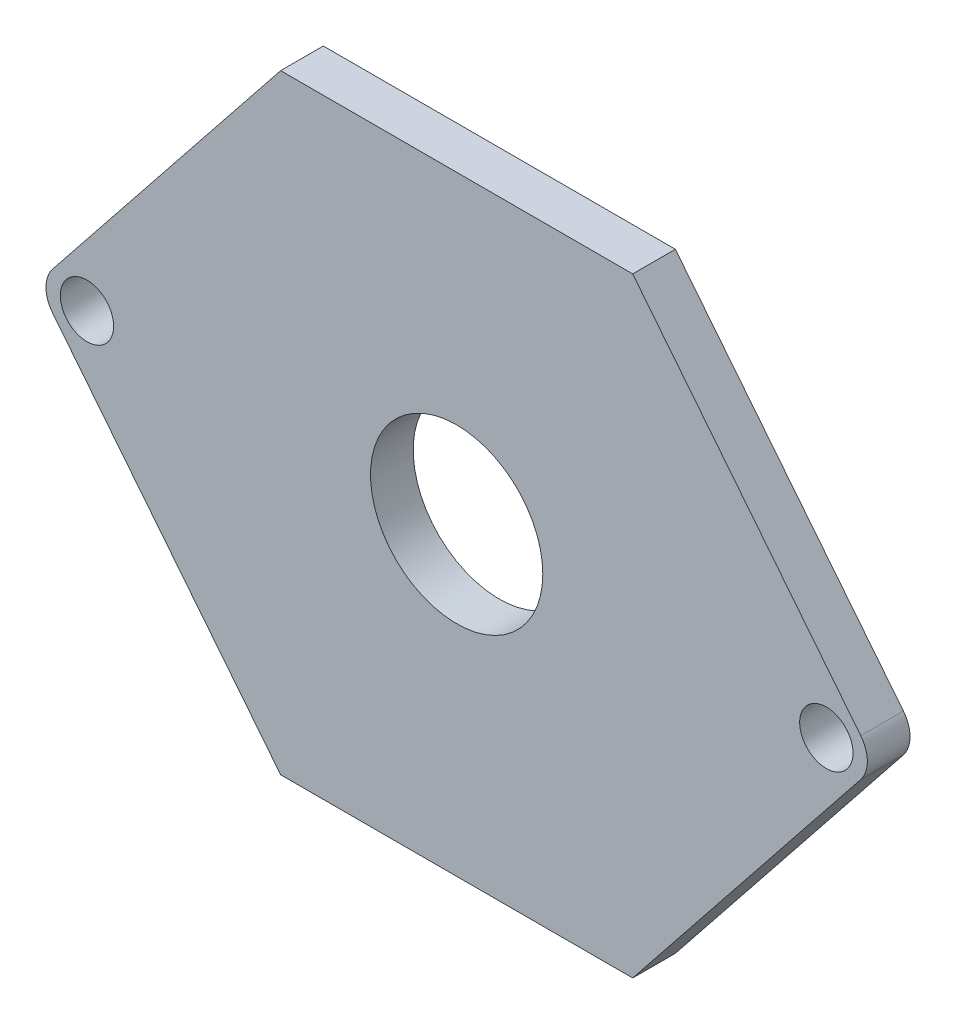
ISO-10303-21;
HEADER;
FILE_DESCRIPTION(('STEP AP214'),'2;1');
FILE_NAME('part.step','',(''),(''),'','','');
FILE_SCHEMA(('AUTOMOTIVE_DESIGN { 1 0 10303 214 1 1 1 1 }'));
ENDSEC;
DATA;
#1=APPLICATION_CONTEXT('core data for automotive mechanical design processes');
#2=APPLICATION_PROTOCOL_DEFINITION('international standard','automotive_design',2000,#1);
#3=PRODUCT_CONTEXT('',#1,'mechanical');
#4=PRODUCT('Part','Part','',(#3));
#5=PRODUCT_RELATED_PRODUCT_CATEGORY('part','',(#4));
#6=PRODUCT_DEFINITION_FORMATION('','',#4);
#7=PRODUCT_DEFINITION_CONTEXT('part definition',#1,'design');
#8=PRODUCT_DEFINITION('design','',#6,#7);
#9=PRODUCT_DEFINITION_SHAPE('','',#8);
#10=(LENGTH_UNIT() NAMED_UNIT(*) SI_UNIT(.MILLI.,.METRE.));
#11=(NAMED_UNIT(*) PLANE_ANGLE_UNIT() SI_UNIT($,.RADIAN.));
#12=(NAMED_UNIT(*) SI_UNIT($,.STERADIAN.) SOLID_ANGLE_UNIT());
#13=UNCERTAINTY_MEASURE_WITH_UNIT(LENGTH_MEASURE(1.E-05),#10,'distance_accuracy_value','');
#14=(GEOMETRIC_REPRESENTATION_CONTEXT(3) GLOBAL_UNCERTAINTY_ASSIGNED_CONTEXT((#13)) GLOBAL_UNIT_ASSIGNED_CONTEXT((#10,
#11,#12)) REPRESENTATION_CONTEXT('',''));
#15=CARTESIAN_POINT('',(0.,0.,0.));
#16=DIRECTION('',(0.,0.,1.));
#17=DIRECTION('',(1.,0.,0.));
#18=AXIS2_PLACEMENT_3D('',#15,#16,#17);
#19=CARTESIAN_POINT('',(0.,0.,2.8));
#20=DIRECTION('',(0.,0.,1.));
#21=DIRECTION('',(1.,0.,0.));
#22=AXIS2_PLACEMENT_3D('',#19,#20,#21);
#23=PLANE('',#22);
#24=CARTESIAN_POINT('',(24.25,0.,2.8));
#25=DIRECTION('',(0.,0.,1.));
#26=DIRECTION('',(1.,0.,0.));
#27=AXIS2_PLACEMENT_3D('',#24,#25,#26);
#28=CIRCLE('',#27,1.75);
#29=CARTESIAN_POINT('',(26.,0.,2.8));
#30=VERTEX_POINT('',#29);
#31=EDGE_CURVE('E188',#30,#30,#28,.T.);
#32=ORIENTED_EDGE('',*,*,#31,.F.);
#33=EDGE_LOOP('',(#32));
#34=FACE_BOUND('',#33,.T.);
#35=DIRECTION('',(0.623574065272578,0.781764277208566,0.));
#36=VECTOR('',#35,1.);
#37=CARTESIAN_POINT('',(27.5,0.,2.8));
#38=LINE('',#37,#36);
#39=CARTESIAN_POINT('',(11.5470053837927,-19.9999999999998,2.8));
#40=VERTEX_POINT('',#39);
#41=CARTESIAN_POINT('',(26.50521262939,-1.24714813054515,2.8));
#42=VERTEX_POINT('',#41);
#43=EDGE_CURVE('E168',#40,#42,#38,.T.);
#44=ORIENTED_EDGE('',*,*,#43,.T.);
#45=CARTESIAN_POINT('',(24.9416840749729,0.,2.8));
#46=DIRECTION('',(0.,0.,1.));
#47=DIRECTION('',(1.,0.,0.));
#48=AXIS2_PLACEMENT_3D('',#45,#46,#47);
#49=CIRCLE('',#48,2.);
#50=CARTESIAN_POINT('',(26.50521262939,1.24714813054517,2.8));
#51=VERTEX_POINT('',#50);
#52=EDGE_CURVE('E135',#42,#51,#49,.T.);
#53=ORIENTED_EDGE('',*,*,#52,.T.);
#54=DIRECTION('',(-0.623574065272579,0.781764277208565,0.));
#55=VECTOR('',#54,1.);
#56=CARTESIAN_POINT('',(11.5470053837925,20.,2.8));
#57=LINE('',#56,#55);
#58=CARTESIAN_POINT('',(11.5470053837925,20.,2.8));
#59=VERTEX_POINT('',#58);
#60=EDGE_CURVE('E109',#51,#59,#57,.T.);
#61=ORIENTED_EDGE('',*,*,#60,.T.);
#62=DIRECTION('',(-1.,0.,0.));
#63=VECTOR('',#62,1.);
#64=CARTESIAN_POINT('',(11.5470053837925,20.,2.8));
#65=LINE('',#64,#63);
#66=CARTESIAN_POINT('',(-11.5470053837926,19.9999999999999,2.8));
#67=VERTEX_POINT('',#66);
#68=EDGE_CURVE('E103',#59,#67,#65,.T.);
#69=ORIENTED_EDGE('',*,*,#68,.T.);
#70=DIRECTION('',(-0.623574065272579,-0.781764277208564,0.));
#71=VECTOR('',#70,1.);
#72=CARTESIAN_POINT('',(-11.5470053837926,19.9999999999999,2.8));
#73=LINE('',#72,#71);
#74=CARTESIAN_POINT('',(-26.50521262939,1.24714813054515,2.8));
#75=VERTEX_POINT('',#74);
#76=EDGE_CURVE('E96',#67,#75,#73,.T.);
#77=ORIENTED_EDGE('',*,*,#76,.T.);
#78=CARTESIAN_POINT('',(-24.9416840749729,0.,2.8));
#79=DIRECTION('',(0.,0.,1.));
#80=DIRECTION('',(1.,0.,0.));
#81=AXIS2_PLACEMENT_3D('',#78,#79,#80);
#82=CIRCLE('',#81,2.);
#83=CARTESIAN_POINT('',(-26.50521262939,-1.24714813054516,2.8));
#84=VERTEX_POINT('',#83);
#85=EDGE_CURVE('E49',#75,#84,#82,.T.);
#86=ORIENTED_EDGE('',*,*,#85,.T.);
#87=DIRECTION('',(0.623574065272579,-0.781764277208565,0.));
#88=VECTOR('',#87,1.);
#89=CARTESIAN_POINT('',(-27.5,0.,2.8));
#90=LINE('',#89,#88);
#91=CARTESIAN_POINT('',(-11.5470053837925,-20.,2.8));
#92=VERTEX_POINT('',#91);
#93=EDGE_CURVE('E102',#84,#92,#90,.T.);
#94=ORIENTED_EDGE('',*,*,#93,.T.);
#95=DIRECTION('',(1.,0.,0.));
#96=VECTOR('',#95,1.);
#97=CARTESIAN_POINT('',(-11.5470053837925,-20.,2.8));
#98=LINE('',#97,#96);
#99=EDGE_CURVE('E178',#92,#40,#98,.T.);
#100=ORIENTED_EDGE('',*,*,#99,.T.);
#101=EDGE_LOOP('',(#44,#53,#61,#69,#77,#86,#94,#100));
#102=FACE_BOUND('',#101,.T.);
#103=CARTESIAN_POINT('',(0.,0.,2.8));
#104=DIRECTION('',(0.,0.,1.));
#105=DIRECTION('',(1.,0.,0.));
#106=AXIS2_PLACEMENT_3D('',#103,#104,#105);
#107=CIRCLE('',#106,5.65066807194559);
#108=CARTESIAN_POINT('',(5.65066807194559,0.,2.8));
#109=VERTEX_POINT('',#108);
#110=EDGE_CURVE('E181',#109,#109,#107,.T.);
#111=ORIENTED_EDGE('',*,*,#110,.F.);
#112=EDGE_LOOP('',(#111));
#113=FACE_BOUND('',#112,.T.);
#114=CARTESIAN_POINT('',(-24.25,0.,2.8));
#115=DIRECTION('',(0.,0.,1.));
#116=DIRECTION('',(1.,0.,0.));
#117=AXIS2_PLACEMENT_3D('',#114,#115,#116);
#118=CIRCLE('',#117,1.75);
#119=CARTESIAN_POINT('',(-22.5,0.,2.8));
#120=VERTEX_POINT('',#119);
#121=EDGE_CURVE('E235',#120,#120,#118,.T.);
#122=ORIENTED_EDGE('',*,*,#121,.F.);
#123=EDGE_LOOP('',(#122));
#124=FACE_BOUND('',#123,.T.);
#125=ADVANCED_FACE('F34',(#34,#102,#113,#124),#23,.T.);
#126=CARTESIAN_POINT('',(0.,0.,0.));
#127=DIRECTION('',(0.,0.,1.));
#128=DIRECTION('',(1.,0.,0.));
#129=AXIS2_PLACEMENT_3D('',#126,#127,#128);
#130=PLANE('',#129);
#131=DIRECTION('',(-0.623574065272579,0.781764277208565,0.));
#132=VECTOR('',#131,1.);
#133=CARTESIAN_POINT('',(11.5470053837925,20.,0.));
#134=LINE('',#133,#132);
#135=CARTESIAN_POINT('',(26.50521262939,1.24714813054517,0.));
#136=VERTEX_POINT('',#135);
#137=CARTESIAN_POINT('',(11.5470053837925,20.,0.));
#138=VERTEX_POINT('',#137);
#139=EDGE_CURVE('E113',#136,#138,#134,.T.);
#140=ORIENTED_EDGE('',*,*,#139,.F.);
#141=CARTESIAN_POINT('',(24.9416840749729,0.,0.));
#142=DIRECTION('',(0.,0.,1.));
#143=DIRECTION('',(1.,0.,0.));
#144=AXIS2_PLACEMENT_3D('',#141,#142,#143);
#145=CIRCLE('',#144,2.);
#146=CARTESIAN_POINT('',(26.50521262939,-1.24714813054515,0.));
#147=VERTEX_POINT('',#146);
#148=EDGE_CURVE('E130',#136,#147,#145,.F.);
#149=ORIENTED_EDGE('',*,*,#148,.T.);
#150=DIRECTION('',(0.623574065272578,0.781764277208566,0.));
#151=VECTOR('',#150,1.);
#152=CARTESIAN_POINT('',(27.5,0.,0.));
#153=LINE('',#152,#151);
#154=CARTESIAN_POINT('',(11.5470053837927,-19.9999999999998,0.));
#155=VERTEX_POINT('',#154);
#156=EDGE_CURVE('E153',#155,#147,#153,.T.);
#157=ORIENTED_EDGE('',*,*,#156,.F.);
#158=DIRECTION('',(1.,0.,0.));
#159=VECTOR('',#158,1.);
#160=CARTESIAN_POINT('',(-11.5470053837925,-20.,0.));
#161=LINE('',#160,#159);
#162=CARTESIAN_POINT('',(-11.5470053837925,-20.,0.));
#163=VERTEX_POINT('',#162);
#164=EDGE_CURVE('E150',#163,#155,#161,.T.);
#165=ORIENTED_EDGE('',*,*,#164,.F.);
#166=DIRECTION('',(0.623574065272579,-0.781764277208565,0.));
#167=VECTOR('',#166,1.);
#168=CARTESIAN_POINT('',(-27.5,0.,0.));
#169=LINE('',#168,#167);
#170=CARTESIAN_POINT('',(-26.50521262939,-1.24714813054516,0.));
#171=VERTEX_POINT('',#170);
#172=EDGE_CURVE('E142',#171,#163,#169,.T.);
#173=ORIENTED_EDGE('',*,*,#172,.F.);
#174=CARTESIAN_POINT('',(-24.9416840749729,0.,0.));
#175=DIRECTION('',(0.,0.,1.));
#176=DIRECTION('',(1.,0.,0.));
#177=AXIS2_PLACEMENT_3D('',#174,#175,#176);
#178=CIRCLE('',#177,2.);
#179=CARTESIAN_POINT('',(-26.50521262939,1.24714813054515,0.));
#180=VERTEX_POINT('',#179);
#181=EDGE_CURVE('E122',#171,#180,#178,.F.);
#182=ORIENTED_EDGE('',*,*,#181,.T.);
#183=DIRECTION('',(-0.623574065272579,-0.781764277208564,0.));
#184=VECTOR('',#183,1.);
#185=CARTESIAN_POINT('',(-11.5470053837926,19.9999999999999,0.));
#186=LINE('',#185,#184);
#187=CARTESIAN_POINT('',(-11.5470053837926,19.9999999999999,0.));
#188=VERTEX_POINT('',#187);
#189=EDGE_CURVE('E151',#188,#180,#186,.T.);
#190=ORIENTED_EDGE('',*,*,#189,.F.);
#191=DIRECTION('',(-1.,0.,0.));
#192=VECTOR('',#191,1.);
#193=CARTESIAN_POINT('',(11.5470053837925,20.,0.));
#194=LINE('',#193,#192);
#195=EDGE_CURVE('E117',#138,#188,#194,.T.);
#196=ORIENTED_EDGE('',*,*,#195,.F.);
#197=EDGE_LOOP('',(#140,#149,#157,#165,#173,#182,#190,#196));
#198=FACE_BOUND('',#197,.T.);
#199=CARTESIAN_POINT('',(0.,0.,0.));
#200=DIRECTION('',(0.,0.,1.));
#201=DIRECTION('',(1.,0.,0.));
#202=AXIS2_PLACEMENT_3D('',#199,#200,#201);
#203=CIRCLE('',#202,5.65066807194559);
#204=CARTESIAN_POINT('',(5.65066807194559,0.,0.));
#205=VERTEX_POINT('',#204);
#206=EDGE_CURVE('E183',#205,#205,#203,.T.);
#207=ORIENTED_EDGE('',*,*,#206,.T.);
#208=EDGE_LOOP('',(#207));
#209=FACE_BOUND('',#208,.T.);
#210=CARTESIAN_POINT('',(24.25,0.,0.));
#211=DIRECTION('',(0.,0.,1.));
#212=DIRECTION('',(1.,0.,0.));
#213=AXIS2_PLACEMENT_3D('',#210,#211,#212);
#214=CIRCLE('',#213,1.75);
#215=CARTESIAN_POINT('',(26.,0.,0.));
#216=VERTEX_POINT('',#215);
#217=EDGE_CURVE('E191',#216,#216,#214,.T.);
#218=ORIENTED_EDGE('',*,*,#217,.T.);
#219=EDGE_LOOP('',(#218));
#220=FACE_BOUND('',#219,.T.);
#221=CARTESIAN_POINT('',(-24.25,0.,0.));
#222=DIRECTION('',(0.,0.,1.));
#223=DIRECTION('',(1.,0.,0.));
#224=AXIS2_PLACEMENT_3D('',#221,#222,#223);
#225=CIRCLE('',#224,1.75);
#226=CARTESIAN_POINT('',(-22.5,0.,0.));
#227=VERTEX_POINT('',#226);
#228=EDGE_CURVE('E233',#227,#227,#225,.T.);
#229=ORIENTED_EDGE('',*,*,#228,.T.);
#230=EDGE_LOOP('',(#229));
#231=FACE_BOUND('',#230,.T.);
#232=ADVANCED_FACE('F147',(#198,#209,#220,#231),#130,.F.);
#233=CARTESIAN_POINT('',(11.5470053837925,20.,2.8));
#234=DIRECTION('',(0.,-1.,0.));
#235=DIRECTION('',(1.,0.,0.));
#236=AXIS2_PLACEMENT_3D('',#233,#234,#235);
#237=PLANE('',#236);
#238=ORIENTED_EDGE('',*,*,#195,.T.);
#239=DIRECTION('',(0.,0.,-1.));
#240=VECTOR('',#239,1.);
#241=CARTESIAN_POINT('',(-11.5470053837926,19.9999999999999,2.8));
#242=LINE('',#241,#240);
#243=EDGE_CURVE('E100',#67,#188,#242,.T.);
#244=ORIENTED_EDGE('',*,*,#243,.F.);
#245=ORIENTED_EDGE('',*,*,#68,.F.);
#246=DIRECTION('',(0.,0.,-1.));
#247=VECTOR('',#246,1.);
#248=CARTESIAN_POINT('',(11.5470053837925,20.,2.8));
#249=LINE('',#248,#247);
#250=EDGE_CURVE('E161',#59,#138,#249,.T.);
#251=ORIENTED_EDGE('',*,*,#250,.T.);
#252=EDGE_LOOP('',(#238,#244,#245,#251));
#253=FACE_BOUND('',#252,.T.);
#254=ADVANCED_FACE('F115',(#253),#237,.F.);
#255=CARTESIAN_POINT('',(-11.5470053837926,19.9999999999999,2.8));
#256=DIRECTION('',(0.781764277208564,-0.623574065272579,0.));
#257=DIRECTION('',(0.623574065272579,0.781764277208564,0.));
#258=AXIS2_PLACEMENT_3D('',#255,#256,#257);
#259=PLANE('',#258);
#260=ORIENTED_EDGE('',*,*,#189,.T.);
#261=DIRECTION('',(0.,0.,-1.));
#262=VECTOR('',#261,1.);
#263=CARTESIAN_POINT('',(-26.50521262939,1.24714813054515,2.8));
#264=LINE('',#263,#262);
#265=EDGE_CURVE('E11',#180,#75,#264,.F.);
#266=ORIENTED_EDGE('',*,*,#265,.T.);
#267=ORIENTED_EDGE('',*,*,#76,.F.);
#268=ORIENTED_EDGE('',*,*,#243,.T.);
#269=EDGE_LOOP('',(#260,#266,#267,#268));
#270=FACE_BOUND('',#269,.T.);
#271=ADVANCED_FACE('F98',(#270),#259,.F.);
#272=CARTESIAN_POINT('',(-27.5,0.,2.8));
#273=DIRECTION('',(0.781764277208565,0.623574065272579,0.));
#274=DIRECTION('',(-0.623574065272579,0.781764277208565,0.));
#275=AXIS2_PLACEMENT_3D('',#272,#273,#274);
#276=PLANE('',#275);
#277=ORIENTED_EDGE('',*,*,#93,.F.);
#278=DIRECTION('',(0.,0.,-1.));
#279=VECTOR('',#278,1.);
#280=CARTESIAN_POINT('',(-26.50521262939,-1.24714813054516,2.8));
#281=LINE('',#280,#279);
#282=EDGE_CURVE('E42',#84,#171,#281,.T.);
#283=ORIENTED_EDGE('',*,*,#282,.T.);
#284=ORIENTED_EDGE('',*,*,#172,.T.);
#285=DIRECTION('',(0.,0.,-1.));
#286=VECTOR('',#285,1.);
#287=CARTESIAN_POINT('',(-11.5470053837925,-20.,2.8));
#288=LINE('',#287,#286);
#289=EDGE_CURVE('E119',#92,#163,#288,.T.);
#290=ORIENTED_EDGE('',*,*,#289,.F.);
#291=EDGE_LOOP('',(#277,#283,#284,#290));
#292=FACE_BOUND('',#291,.T.);
#293=ADVANCED_FACE('F140',(#292),#276,.F.);
#294=CARTESIAN_POINT('',(-11.5470053837925,-20.,2.8));
#295=DIRECTION('',(0.,1.,0.));
#296=DIRECTION('',(-1.,0.,0.));
#297=AXIS2_PLACEMENT_3D('',#294,#295,#296);
#298=PLANE('',#297);
#299=ORIENTED_EDGE('',*,*,#164,.T.);
#300=DIRECTION('',(0.,0.,-1.));
#301=VECTOR('',#300,1.);
#302=CARTESIAN_POINT('',(11.5470053837927,-19.9999999999998,2.8));
#303=LINE('',#302,#301);
#304=EDGE_CURVE('E125',#40,#155,#303,.T.);
#305=ORIENTED_EDGE('',*,*,#304,.F.);
#306=ORIENTED_EDGE('',*,*,#99,.F.);
#307=ORIENTED_EDGE('',*,*,#289,.T.);
#308=EDGE_LOOP('',(#299,#305,#306,#307));
#309=FACE_BOUND('',#308,.T.);
#310=ADVANCED_FACE('F194',(#309),#298,.F.);
#311=CARTESIAN_POINT('',(27.5,0.,2.8));
#312=DIRECTION('',(-0.781764277208566,0.623574065272578,0.));
#313=DIRECTION('',(-0.623574065272578,-0.781764277208566,0.));
#314=AXIS2_PLACEMENT_3D('',#311,#312,#313);
#315=PLANE('',#314);
#316=ORIENTED_EDGE('',*,*,#156,.T.);
#317=DIRECTION('',(0.,0.,-1.));
#318=VECTOR('',#317,1.);
#319=CARTESIAN_POINT('',(26.50521262939,-1.24714813054515,2.8));
#320=LINE('',#319,#318);
#321=EDGE_CURVE('E132',#147,#42,#320,.F.);
#322=ORIENTED_EDGE('',*,*,#321,.T.);
#323=ORIENTED_EDGE('',*,*,#43,.F.);
#324=ORIENTED_EDGE('',*,*,#304,.T.);
#325=EDGE_LOOP('',(#316,#322,#323,#324));
#326=FACE_BOUND('',#325,.T.);
#327=ADVANCED_FACE('F166',(#326),#315,.F.);
#328=CARTESIAN_POINT('',(11.5470053837925,20.,2.8));
#329=DIRECTION('',(-0.781764277208565,-0.623574065272579,0.));
#330=DIRECTION('',(0.623574065272579,-0.781764277208565,0.));
#331=AXIS2_PLACEMENT_3D('',#328,#329,#330);
#332=PLANE('',#331);
#333=ORIENTED_EDGE('',*,*,#60,.F.);
#334=DIRECTION('',(0.,0.,-1.));
#335=VECTOR('',#334,1.);
#336=CARTESIAN_POINT('',(26.50521262939,1.24714813054517,2.8));
#337=LINE('',#336,#335);
#338=EDGE_CURVE('E118',#51,#136,#337,.T.);
#339=ORIENTED_EDGE('',*,*,#338,.T.);
#340=ORIENTED_EDGE('',*,*,#139,.T.);
#341=ORIENTED_EDGE('',*,*,#250,.F.);
#342=EDGE_LOOP('',(#333,#339,#340,#341));
#343=FACE_BOUND('',#342,.T.);
#344=ADVANCED_FACE('F176',(#343),#332,.F.);
#345=CARTESIAN_POINT('',(0.,0.,2.8));
#346=DIRECTION('',(0.,0.,-1.));
#347=DIRECTION('',(-1.,0.,0.));
#348=AXIS2_PLACEMENT_3D('',#345,#346,#347);
#349=CYLINDRICAL_SURFACE('',#348,5.65066807194559);
#350=ORIENTED_EDGE('',*,*,#110,.T.);
#351=EDGE_LOOP('',(#350));
#352=FACE_BOUND('',#351,.T.);
#353=ORIENTED_EDGE('',*,*,#206,.F.);
#354=EDGE_LOOP('',(#353));
#355=FACE_BOUND('',#354,.T.);
#356=ADVANCED_FACE('F212',(#352,#355),#349,.F.);
#357=CARTESIAN_POINT('',(24.25,0.,2.8));
#358=DIRECTION('',(0.,0.,-1.));
#359=DIRECTION('',(-1.,0.,0.));
#360=AXIS2_PLACEMENT_3D('',#357,#358,#359);
#361=CYLINDRICAL_SURFACE('',#360,1.75);
#362=ORIENTED_EDGE('',*,*,#31,.T.);
#363=EDGE_LOOP('',(#362));
#364=FACE_BOUND('',#363,.T.);
#365=ORIENTED_EDGE('',*,*,#217,.F.);
#366=EDGE_LOOP('',(#365));
#367=FACE_BOUND('',#366,.T.);
#368=ADVANCED_FACE('F219',(#364,#367),#361,.F.);
#369=CARTESIAN_POINT('',(-24.25,0.,2.8));
#370=DIRECTION('',(0.,0.,-1.));
#371=DIRECTION('',(-1.,0.,0.));
#372=AXIS2_PLACEMENT_3D('',#369,#370,#371);
#373=CYLINDRICAL_SURFACE('',#372,1.75);
#374=ORIENTED_EDGE('',*,*,#121,.T.);
#375=EDGE_LOOP('',(#374));
#376=FACE_BOUND('',#375,.T.);
#377=ORIENTED_EDGE('',*,*,#228,.F.);
#378=EDGE_LOOP('',(#377));
#379=FACE_BOUND('',#378,.T.);
#380=ADVANCED_FACE('F223',(#376,#379),#373,.F.);
#381=CARTESIAN_POINT('',(24.9416840749729,0.,2.8));
#382=DIRECTION('',(0.,0.,-1.));
#383=DIRECTION('',(-1.,0.,0.));
#384=AXIS2_PLACEMENT_3D('',#381,#382,#383);
#385=CYLINDRICAL_SURFACE('',#384,2.);
#386=ORIENTED_EDGE('',*,*,#52,.F.);
#387=ORIENTED_EDGE('',*,*,#321,.F.);
#388=ORIENTED_EDGE('',*,*,#148,.F.);
#389=ORIENTED_EDGE('',*,*,#338,.F.);
#390=EDGE_LOOP('',(#386,#387,#388,#389));
#391=FACE_BOUND('',#390,.T.);
#392=ADVANCED_FACE('F174',(#391),#385,.T.);
#393=CARTESIAN_POINT('',(-24.9416840749729,0.,2.8));
#394=DIRECTION('',(0.,0.,-1.));
#395=DIRECTION('',(-1.,0.,0.));
#396=AXIS2_PLACEMENT_3D('',#393,#394,#395);
#397=CYLINDRICAL_SURFACE('',#396,2.);
#398=ORIENTED_EDGE('',*,*,#85,.F.);
#399=ORIENTED_EDGE('',*,*,#265,.F.);
#400=ORIENTED_EDGE('',*,*,#181,.F.);
#401=ORIENTED_EDGE('',*,*,#282,.F.);
#402=EDGE_LOOP('',(#398,#399,#400,#401));
#403=FACE_BOUND('',#402,.T.);
#404=ADVANCED_FACE('F36',(#403),#397,.T.);
#405=CLOSED_SHELL('',(#125,#232,#254,#271,#293,#310,#327,#344,#356,#368,#380,#392,#404));
#406=MANIFOLD_SOLID_BREP('B2',#405);
#407=ADVANCED_BREP_SHAPE_REPRESENTATION('',(#18,#406),#14);
#408=SHAPE_DEFINITION_REPRESENTATION(#9,#407);
ENDSEC;
END-ISO-10303-21;
